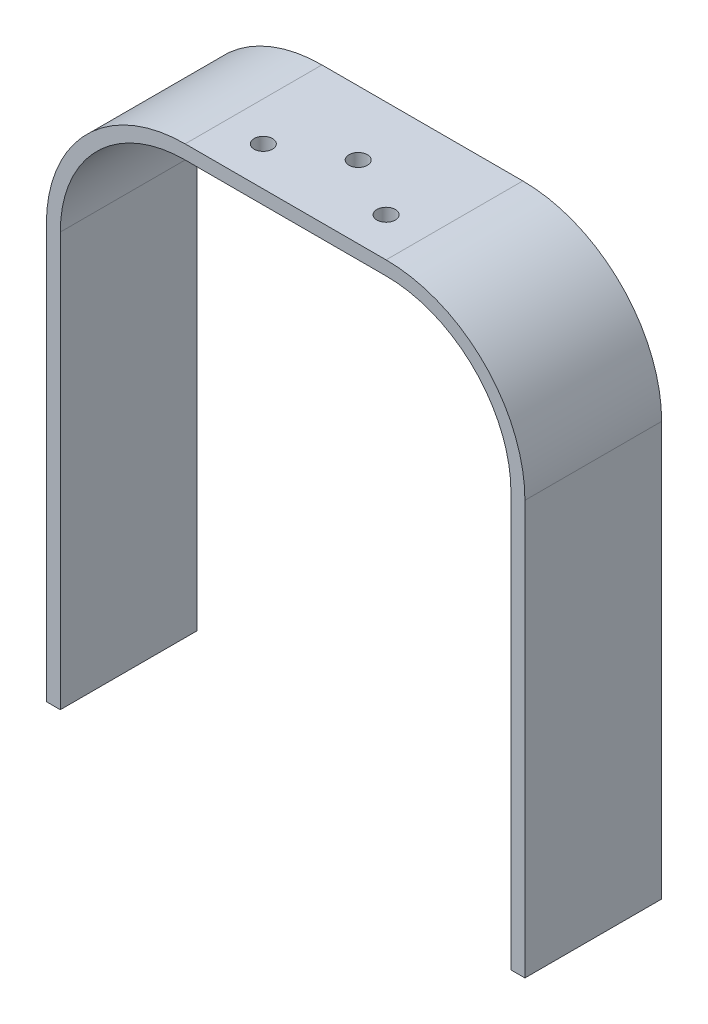
ISO-10303-21;
HEADER;
FILE_DESCRIPTION(('STEP AP214'),'2;1');
FILE_NAME('part.step','',(''),(''),'','','');
FILE_SCHEMA(('AUTOMOTIVE_DESIGN { 1 0 10303 214 1 1 1 1 }'));
ENDSEC;
DATA;
#1=APPLICATION_CONTEXT('core data for automotive mechanical design processes');
#2=APPLICATION_PROTOCOL_DEFINITION('international standard','automotive_design',2000,#1);
#3=PRODUCT_CONTEXT('',#1,'mechanical');
#4=PRODUCT('Part','Part','',(#3));
#5=PRODUCT_RELATED_PRODUCT_CATEGORY('part','',(#4));
#6=PRODUCT_DEFINITION_FORMATION('','',#4);
#7=PRODUCT_DEFINITION_CONTEXT('part definition',#1,'design');
#8=PRODUCT_DEFINITION('design','',#6,#7);
#9=PRODUCT_DEFINITION_SHAPE('','',#8);
#10=(LENGTH_UNIT() NAMED_UNIT(*) SI_UNIT(.MILLI.,.METRE.));
#11=(NAMED_UNIT(*) PLANE_ANGLE_UNIT() SI_UNIT($,.RADIAN.));
#12=(NAMED_UNIT(*) SI_UNIT($,.STERADIAN.) SOLID_ANGLE_UNIT());
#13=UNCERTAINTY_MEASURE_WITH_UNIT(LENGTH_MEASURE(1.E-05),#10,'distance_accuracy_value','');
#14=(GEOMETRIC_REPRESENTATION_CONTEXT(3) GLOBAL_UNCERTAINTY_ASSIGNED_CONTEXT((#13)) GLOBAL_UNIT_ASSIGNED_CONTEXT((#10,
#11,#12)) REPRESENTATION_CONTEXT('',''));
#15=CARTESIAN_POINT('',(0.,0.,0.));
#16=DIRECTION('',(0.,0.,1.));
#17=DIRECTION('',(1.,0.,0.));
#18=AXIS2_PLACEMENT_3D('',#15,#16,#17);
#19=CARTESIAN_POINT('',(-55.2541428168686,-8.814890245695,-4.96942607480638));
#20=DIRECTION('',(0.,1.,0.));
#21=DIRECTION('',(0.,0.,-1.));
#22=AXIS2_PLACEMENT_3D('',#19,#20,#21);
#23=PLANE('',#22);
#24=DIRECTION('',(-1.,0.,0.));
#25=VECTOR('',#24,1.);
#26=CARTESIAN_POINT('',(-55.2541428168686,-8.814890245695,-17.2194260748064));
#27=LINE('',#26,#25);
#28=CARTESIAN_POINT('',(-54.0041428168686,-8.814890245695,-17.2194260748064));
#29=VERTEX_POINT('',#28);
#30=CARTESIAN_POINT('',(-56.5041428168686,-8.814890245695,-17.2194260748064));
#31=VERTEX_POINT('',#30);
#32=EDGE_CURVE('E11',#29,#31,#27,.T.);
#33=ORIENTED_EDGE('',*,*,#32,.F.);
#34=DIRECTION('',(0.,0.,1.));
#35=VECTOR('',#34,1.);
#36=CARTESIAN_POINT('',(-54.0041428168686,-8.814890245695,-4.96942607480638));
#37=LINE('',#36,#35);
#38=CARTESIAN_POINT('',(-54.0041428168686,-8.814890245695,7.28057392519362));
#39=VERTEX_POINT('',#38);
#40=EDGE_CURVE('E174',#39,#29,#37,.F.);
#41=ORIENTED_EDGE('',*,*,#40,.F.);
#42=DIRECTION('',(-1.,0.,0.));
#43=VECTOR('',#42,1.);
#44=CARTESIAN_POINT('',(-55.2541428168686,-8.814890245695,7.28057392519362));
#45=LINE('',#44,#43);
#46=CARTESIAN_POINT('',(-56.5041428168686,-8.814890245695,7.28057392519362));
#47=VERTEX_POINT('',#46);
#48=EDGE_CURVE('E61',#39,#47,#45,.T.);
#49=ORIENTED_EDGE('',*,*,#48,.T.);
#50=DIRECTION('',(0.,0.,1.));
#51=VECTOR('',#50,1.);
#52=CARTESIAN_POINT('',(-56.5041428168686,-8.814890245695,-4.96942607480638));
#53=LINE('',#52,#51);
#54=EDGE_CURVE('E201',#47,#31,#53,.F.);
#55=ORIENTED_EDGE('',*,*,#54,.T.);
#56=EDGE_LOOP('',(#33,#41,#49,#55));
#57=FACE_BOUND('',#56,.T.);
#58=ADVANCED_FACE('F51',(#57),#23,.F.);
#59=CARTESIAN_POINT('',(27.9958571831288,-8.81489024569501,7.2805739251936));
#60=DIRECTION('',(0.,0.,1.));
#61=DIRECTION('',(0.,-1.,0.));
#62=AXIS2_PLACEMENT_3D('',#59,#60,#61);
#63=PLANE('',#62);
#64=DIRECTION('',(0.,1.,0.));
#65=VECTOR('',#64,1.);
#66=CARTESIAN_POINT('',(29.2458571831288,-8.81489024569501,7.2805739251936));
#67=LINE('',#66,#65);
#68=CARTESIAN_POINT('',(29.2458571831288,65.3101097543063,7.2805739251936));
#69=VERTEX_POINT('',#68);
#70=CARTESIAN_POINT('',(29.2458571831288,-8.81489024569501,7.2805739251936));
#71=VERTEX_POINT('',#70);
#72=EDGE_CURVE('E230',#69,#71,#67,.F.);
#73=ORIENTED_EDGE('',*,*,#72,.F.);
#74=CARTESIAN_POINT('',(4.37085718313007,65.3101097543063,7.2805739251936));
#75=DIRECTION('',(0.,0.,-1.));
#76=DIRECTION('',(-1.,0.,0.));
#77=AXIS2_PLACEMENT_3D('',#74,#75,#76);
#78=CIRCLE('',#77,24.8749999999987);
#79=CARTESIAN_POINT('',(4.37085718313007,90.185109754305,7.28057392519361));
#80=VERTEX_POINT('',#79);
#81=EDGE_CURVE('E274',#80,#69,#78,.T.);
#82=ORIENTED_EDGE('',*,*,#81,.F.);
#83=DIRECTION('',(1.,0.,0.));
#84=VECTOR('',#83,1.);
#85=CARTESIAN_POINT('',(-31.6291428168699,90.185109754305,7.28057392519361));
#86=LINE('',#85,#84);
#87=CARTESIAN_POINT('',(-31.6291428168699,90.185109754305,7.28057392519361));
#88=VERTEX_POINT('',#87);
#89=EDGE_CURVE('E224',#88,#80,#86,.T.);
#90=ORIENTED_EDGE('',*,*,#89,.F.);
#91=CARTESIAN_POINT('',(-31.6291428168699,65.3101097543063,7.28057392519361));
#92=DIRECTION('',(0.,0.,-1.));
#93=DIRECTION('',(-1.,0.,0.));
#94=AXIS2_PLACEMENT_3D('',#91,#92,#93);
#95=CIRCLE('',#94,24.8749999999987);
#96=CARTESIAN_POINT('',(-56.5041428168686,65.3101097543063,7.28057392519362));
#97=VERTEX_POINT('',#96);
#98=EDGE_CURVE('E219',#97,#88,#95,.T.);
#99=ORIENTED_EDGE('',*,*,#98,.F.);
#100=DIRECTION('',(0.,1.,0.));
#101=VECTOR('',#100,1.);
#102=CARTESIAN_POINT('',(-56.5041428168686,-8.814890245695,7.28057392519362));
#103=LINE('',#102,#101);
#104=EDGE_CURVE('E149',#47,#97,#103,.T.);
#105=ORIENTED_EDGE('',*,*,#104,.F.);
#106=ORIENTED_EDGE('',*,*,#48,.F.);
#107=DIRECTION('',(0.,1.,0.));
#108=VECTOR('',#107,1.);
#109=CARTESIAN_POINT('',(-54.0041428168686,-8.814890245695,7.28057392519362));
#110=LINE('',#109,#108);
#111=CARTESIAN_POINT('',(-54.0041428168686,65.3101097543063,7.28057392519362));
#112=VERTEX_POINT('',#111);
#113=EDGE_CURVE('E169',#39,#112,#110,.T.);
#114=ORIENTED_EDGE('',*,*,#113,.T.);
#115=CARTESIAN_POINT('',(-31.6291428168699,65.3101097543063,7.28057392519361));
#116=DIRECTION('',(0.,0.,-1.));
#117=DIRECTION('',(-1.,0.,0.));
#118=AXIS2_PLACEMENT_3D('',#115,#116,#117);
#119=CIRCLE('',#118,22.3749999999987);
#120=CARTESIAN_POINT('',(-31.6291428168699,87.685109754305,7.28057392519361));
#121=VERTEX_POINT('',#120);
#122=EDGE_CURVE('E165',#112,#121,#119,.T.);
#123=ORIENTED_EDGE('',*,*,#122,.T.);
#124=DIRECTION('',(1.,0.,0.));
#125=VECTOR('',#124,1.);
#126=CARTESIAN_POINT('',(-31.6291428168699,87.685109754305,7.28057392519361));
#127=LINE('',#126,#125);
#128=CARTESIAN_POINT('',(4.37085718313007,87.685109754305,7.28057392519361));
#129=VERTEX_POINT('',#128);
#130=EDGE_CURVE('E161',#121,#129,#127,.T.);
#131=ORIENTED_EDGE('',*,*,#130,.T.);
#132=CARTESIAN_POINT('',(4.37085718313007,65.3101097543063,7.2805739251936));
#133=DIRECTION('',(0.,0.,-1.));
#134=DIRECTION('',(-1.,0.,0.));
#135=AXIS2_PLACEMENT_3D('',#132,#133,#134);
#136=CIRCLE('',#135,22.3749999999987);
#137=CARTESIAN_POINT('',(26.7458571831288,65.3101097543063,7.2805739251936));
#138=VERTEX_POINT('',#137);
#139=EDGE_CURVE('E158',#129,#138,#136,.T.);
#140=ORIENTED_EDGE('',*,*,#139,.T.);
#141=DIRECTION('',(0.,1.,0.));
#142=VECTOR('',#141,1.);
#143=CARTESIAN_POINT('',(26.7458571831288,-8.81489024569501,7.2805739251936));
#144=LINE('',#143,#142);
#145=CARTESIAN_POINT('',(26.7458571831288,-8.81489024569501,7.2805739251936));
#146=VERTEX_POINT('',#145);
#147=EDGE_CURVE('E132',#138,#146,#144,.F.);
#148=ORIENTED_EDGE('',*,*,#147,.T.);
#149=DIRECTION('',(1.,0.,0.));
#150=VECTOR('',#149,1.);
#151=CARTESIAN_POINT('',(27.9958571831288,-8.81489024569501,7.2805739251936));
#152=LINE('',#151,#150);
#153=EDGE_CURVE('E191',#146,#71,#152,.T.);
#154=ORIENTED_EDGE('',*,*,#153,.T.);
#155=EDGE_LOOP('',(#73,#82,#90,#99,#105,#106,#114,#123,#131,#140,#148,#154));
#156=FACE_BOUND('',#155,.T.);
#157=ADVANCED_FACE('F216',(#156),#63,.T.);
#158=CARTESIAN_POINT('',(27.9958571831288,-8.81489024569501,-4.9694260748064));
#159=DIRECTION('',(0.,-1.,0.));
#160=DIRECTION('',(0.,0.,-1.));
#161=AXIS2_PLACEMENT_3D('',#158,#159,#160);
#162=PLANE('',#161);
#163=ORIENTED_EDGE('',*,*,#153,.F.);
#164=DIRECTION('',(0.,0.,1.));
#165=VECTOR('',#164,1.);
#166=CARTESIAN_POINT('',(26.7458571831288,-8.81489024569501,-4.9694260748064));
#167=LINE('',#166,#165);
#168=CARTESIAN_POINT('',(26.7458571831287,-8.81489024569501,-17.2194260748064));
#169=VERTEX_POINT('',#168);
#170=EDGE_CURVE('E146',#146,#169,#167,.F.);
#171=ORIENTED_EDGE('',*,*,#170,.T.);
#172=DIRECTION('',(1.,0.,0.));
#173=VECTOR('',#172,1.);
#174=CARTESIAN_POINT('',(27.9958571831288,-8.81489024569501,-17.2194260748064));
#175=LINE('',#174,#173);
#176=CARTESIAN_POINT('',(29.2458571831288,-8.81489024569501,-17.2194260748064));
#177=VERTEX_POINT('',#176);
#178=EDGE_CURVE('E144',#169,#177,#175,.T.);
#179=ORIENTED_EDGE('',*,*,#178,.T.);
#180=DIRECTION('',(0.,0.,1.));
#181=VECTOR('',#180,1.);
#182=CARTESIAN_POINT('',(29.2458571831288,-8.81489024569501,-4.9694260748064));
#183=LINE('',#182,#181);
#184=EDGE_CURVE('E192',#71,#177,#183,.F.);
#185=ORIENTED_EDGE('',*,*,#184,.F.);
#186=EDGE_LOOP('',(#163,#171,#179,#185));
#187=FACE_BOUND('',#186,.T.);
#188=ADVANCED_FACE('F259',(#187),#162,.T.);
#189=CARTESIAN_POINT('',(4.37085718313007,65.3101097543063,-17.2194260748064));
#190=DIRECTION('',(0.,0.,1.));
#191=DIRECTION('',(1.,0.,0.));
#192=AXIS2_PLACEMENT_3D('',#189,#190,#191);
#193=PLANE('',#192);
#194=CARTESIAN_POINT('',(4.37085718313007,65.3101097543063,-17.2194260748064));
#195=DIRECTION('',(0.,0.,-1.));
#196=DIRECTION('',(-1.,0.,0.));
#197=AXIS2_PLACEMENT_3D('',#194,#195,#196);
#198=CIRCLE('',#197,22.3749999999987);
#199=CARTESIAN_POINT('',(4.37085718313007,87.685109754305,-17.2194260748064));
#200=VERTEX_POINT('',#199);
#201=CARTESIAN_POINT('',(26.7458571831288,65.3101097543063,-17.2194260748064));
#202=VERTEX_POINT('',#201);
#203=EDGE_CURVE('E135',#200,#202,#198,.T.);
#204=ORIENTED_EDGE('',*,*,#203,.F.);
#205=DIRECTION('',(1.,0.,0.));
#206=VECTOR('',#205,1.);
#207=CARTESIAN_POINT('',(-31.6291428168699,87.685109754305,-17.2194260748064));
#208=LINE('',#207,#206);
#209=CARTESIAN_POINT('',(-31.6291428168699,87.685109754305,-17.2194260748064));
#210=VERTEX_POINT('',#209);
#211=EDGE_CURVE('E186',#210,#200,#208,.T.);
#212=ORIENTED_EDGE('',*,*,#211,.F.);
#213=CARTESIAN_POINT('',(-31.6291428168699,65.3101097543063,-17.2194260748064));
#214=DIRECTION('',(0.,0.,-1.));
#215=DIRECTION('',(-1.,0.,0.));
#216=AXIS2_PLACEMENT_3D('',#213,#214,#215);
#217=CIRCLE('',#216,22.3749999999987);
#218=CARTESIAN_POINT('',(-54.0041428168686,65.3101097543063,-17.2194260748064));
#219=VERTEX_POINT('',#218);
#220=EDGE_CURVE('E181',#219,#210,#217,.T.);
#221=ORIENTED_EDGE('',*,*,#220,.F.);
#222=DIRECTION('',(0.,1.,0.));
#223=VECTOR('',#222,1.);
#224=CARTESIAN_POINT('',(-54.0041428168686,-8.814890245695,-17.2194260748064));
#225=LINE('',#224,#223);
#226=EDGE_CURVE('E157',#29,#219,#225,.T.);
#227=ORIENTED_EDGE('',*,*,#226,.F.);
#228=ORIENTED_EDGE('',*,*,#32,.T.);
#229=DIRECTION('',(0.,1.,0.));
#230=VECTOR('',#229,1.);
#231=CARTESIAN_POINT('',(-56.5041428168686,-8.814890245695,-17.2194260748064));
#232=LINE('',#231,#230);
#233=CARTESIAN_POINT('',(-56.5041428168686,65.3101097543063,-17.2194260748064));
#234=VERTEX_POINT('',#233);
#235=EDGE_CURVE('E211',#31,#234,#232,.T.);
#236=ORIENTED_EDGE('',*,*,#235,.T.);
#237=CARTESIAN_POINT('',(-31.6291428168699,65.3101097543063,-17.2194260748064));
#238=DIRECTION('',(0.,0.,-1.));
#239=DIRECTION('',(-1.,0.,0.));
#240=AXIS2_PLACEMENT_3D('',#237,#238,#239);
#241=CIRCLE('',#240,24.8749999999987);
#242=CARTESIAN_POINT('',(-31.6291428168699,90.185109754305,-17.2194260748064));
#243=VERTEX_POINT('',#242);
#244=EDGE_CURVE('E231',#234,#243,#241,.T.);
#245=ORIENTED_EDGE('',*,*,#244,.T.);
#246=DIRECTION('',(1.,0.,0.));
#247=VECTOR('',#246,1.);
#248=CARTESIAN_POINT('',(-31.6291428168699,90.185109754305,-17.2194260748064));
#249=LINE('',#248,#247);
#250=CARTESIAN_POINT('',(4.37085718313007,90.185109754305,-17.2194260748064));
#251=VERTEX_POINT('',#250);
#252=EDGE_CURVE('E236',#243,#251,#249,.T.);
#253=ORIENTED_EDGE('',*,*,#252,.T.);
#254=CARTESIAN_POINT('',(4.37085718313007,65.3101097543063,-17.2194260748064));
#255=DIRECTION('',(0.,0.,-1.));
#256=DIRECTION('',(-1.,0.,0.));
#257=AXIS2_PLACEMENT_3D('',#254,#255,#256);
#258=CIRCLE('',#257,24.8749999999987);
#259=CARTESIAN_POINT('',(29.2458571831288,65.3101097543063,-17.2194260748064));
#260=VERTEX_POINT('',#259);
#261=EDGE_CURVE('E241',#251,#260,#258,.T.);
#262=ORIENTED_EDGE('',*,*,#261,.T.);
#263=DIRECTION('',(0.,1.,0.));
#264=VECTOR('',#263,1.);
#265=CARTESIAN_POINT('',(29.2458571831288,-8.81489024569501,-17.2194260748064));
#266=LINE('',#265,#264);
#267=EDGE_CURVE('E266',#260,#177,#266,.F.);
#268=ORIENTED_EDGE('',*,*,#267,.T.);
#269=ORIENTED_EDGE('',*,*,#178,.F.);
#270=DIRECTION('',(0.,1.,0.));
#271=VECTOR('',#270,1.);
#272=CARTESIAN_POINT('',(26.7458571831287,-8.81489024569501,-17.2194260748064));
#273=LINE('',#272,#271);
#274=EDGE_CURVE('E129',#202,#169,#273,.F.);
#275=ORIENTED_EDGE('',*,*,#274,.F.);
#276=EDGE_LOOP('',(#204,#212,#221,#227,#228,#236,#245,#253,#262,#268,#269,#275));
#277=FACE_BOUND('',#276,.T.);
#278=ADVANCED_FACE('F53',(#277),#193,.F.);
#279=CARTESIAN_POINT('',(29.2458571831288,-8.81489024569501,-4.9694260748064));
#280=DIRECTION('',(1.,0.,0.));
#281=DIRECTION('',(0.,1.,0.));
#282=AXIS2_PLACEMENT_3D('',#279,#280,#281);
#283=PLANE('',#282);
#284=ORIENTED_EDGE('',*,*,#267,.F.);
#285=DIRECTION('',(0.,0.,-1.));
#286=VECTOR('',#285,1.);
#287=CARTESIAN_POINT('',(29.2458571831288,65.3101097543063,-4.9694260748064));
#288=LINE('',#287,#286);
#289=EDGE_CURVE('E244',#69,#260,#288,.T.);
#290=ORIENTED_EDGE('',*,*,#289,.F.);
#291=ORIENTED_EDGE('',*,*,#72,.T.);
#292=ORIENTED_EDGE('',*,*,#184,.T.);
#293=EDGE_LOOP('',(#284,#290,#291,#292));
#294=FACE_BOUND('',#293,.T.);
#295=ADVANCED_FACE('F306',(#294),#283,.T.);
#296=CARTESIAN_POINT('',(4.37085718313007,65.3101097543063,-4.9694260748064));
#297=DIRECTION('',(0.,0.,-1.));
#298=DIRECTION('',(-1.,0.,0.));
#299=AXIS2_PLACEMENT_3D('',#296,#297,#298);
#300=CYLINDRICAL_SURFACE('',#299,24.8749999999987);
#301=ORIENTED_EDGE('',*,*,#261,.F.);
#302=DIRECTION('',(0.,0.,1.));
#303=VECTOR('',#302,1.);
#304=CARTESIAN_POINT('',(4.37085718313007,90.185109754305,-4.96942607480639));
#305=LINE('',#304,#303);
#306=EDGE_CURVE('E240',#80,#251,#305,.F.);
#307=ORIENTED_EDGE('',*,*,#306,.F.);
#308=ORIENTED_EDGE('',*,*,#81,.T.);
#309=ORIENTED_EDGE('',*,*,#289,.T.);
#310=EDGE_LOOP('',(#301,#307,#308,#309));
#311=FACE_BOUND('',#310,.T.);
#312=ADVANCED_FACE('F292',(#311),#300,.T.);
#313=CARTESIAN_POINT('',(-31.6291428168699,90.185109754305,-4.96942607480639));
#314=DIRECTION('',(0.,1.,0.));
#315=DIRECTION('',(0.,0.,1.));
#316=AXIS2_PLACEMENT_3D('',#313,#314,#315);
#317=PLANE('',#316);
#318=CARTESIAN_POINT('',(-24.6291428168699,90.185109754305,0.280573925193613));
#319=DIRECTION('',(0.,1.,0.));
#320=DIRECTION('',(0.,0.,1.));
#321=AXIS2_PLACEMENT_3D('',#318,#319,#320);
#322=CIRCLE('',#321,1.65);
#323=CARTESIAN_POINT('',(-24.6291428168699,90.185109754305,1.93057392519361));
#324=VERTEX_POINT('',#323);
#325=EDGE_CURVE('E346',#324,#324,#322,.T.);
#326=ORIENTED_EDGE('',*,*,#325,.F.);
#327=EDGE_LOOP('',(#326));
#328=FACE_BOUND('',#327,.T.);
#329=CARTESIAN_POINT('',(-2.62914281686993,90.185109754305,0.280573925193613));
#330=DIRECTION('',(0.,1.,0.));
#331=DIRECTION('',(0.,0.,-1.));
#332=AXIS2_PLACEMENT_3D('',#329,#330,#331);
#333=CIRCLE('',#332,1.65);
#334=CARTESIAN_POINT('',(-2.62914281686993,90.185109754305,1.93057392519361));
#335=VERTEX_POINT('',#334);
#336=EDGE_CURVE('E350',#335,#335,#333,.T.);
#337=ORIENTED_EDGE('',*,*,#336,.F.);
#338=EDGE_LOOP('',(#337));
#339=FACE_BOUND('',#338,.T.);
#340=CARTESIAN_POINT('',(-13.6291428168699,90.185109754305,-5.71942607480639));
#341=DIRECTION('',(0.,1.,0.));
#342=DIRECTION('',(0.,0.,1.));
#343=AXIS2_PLACEMENT_3D('',#340,#341,#342);
#344=CIRCLE('',#343,1.65);
#345=CARTESIAN_POINT('',(-13.6291428168699,90.185109754305,-4.06942607480639));
#346=VERTEX_POINT('',#345);
#347=EDGE_CURVE('E353',#346,#346,#344,.T.);
#348=ORIENTED_EDGE('',*,*,#347,.F.);
#349=EDGE_LOOP('',(#348));
#350=FACE_BOUND('',#349,.T.);
#351=ORIENTED_EDGE('',*,*,#252,.F.);
#352=DIRECTION('',(0.,0.,-1.));
#353=VECTOR('',#352,1.);
#354=CARTESIAN_POINT('',(-31.6291428168699,90.185109754305,-4.96942607480639));
#355=LINE('',#354,#353);
#356=EDGE_CURVE('E235',#88,#243,#355,.T.);
#357=ORIENTED_EDGE('',*,*,#356,.F.);
#358=ORIENTED_EDGE('',*,*,#89,.T.);
#359=ORIENTED_EDGE('',*,*,#306,.T.);
#360=EDGE_LOOP('',(#351,#357,#358,#359));
#361=FACE_BOUND('',#360,.T.);
#362=ADVANCED_FACE('F284',(#328,#339,#350,#361),#317,.T.);
#363=CARTESIAN_POINT('',(-31.6291428168699,65.3101097543063,-4.96942607480639));
#364=DIRECTION('',(0.,0.,-1.));
#365=DIRECTION('',(-1.,0.,0.));
#366=AXIS2_PLACEMENT_3D('',#363,#364,#365);
#367=CYLINDRICAL_SURFACE('',#366,24.8749999999987);
#368=ORIENTED_EDGE('',*,*,#244,.F.);
#369=DIRECTION('',(0.,0.,1.));
#370=VECTOR('',#369,1.);
#371=CARTESIAN_POINT('',(-56.5041428168686,65.3101097543063,-4.96942607480638));
#372=LINE('',#371,#370);
#373=EDGE_CURVE('E213',#97,#234,#372,.F.);
#374=ORIENTED_EDGE('',*,*,#373,.F.);
#375=ORIENTED_EDGE('',*,*,#98,.T.);
#376=ORIENTED_EDGE('',*,*,#356,.T.);
#377=EDGE_LOOP('',(#368,#374,#375,#376));
#378=FACE_BOUND('',#377,.T.);
#379=ADVANCED_FACE('F301',(#378),#367,.T.);
#380=CARTESIAN_POINT('',(-56.5041428168686,-8.814890245695,-4.96942607480638));
#381=DIRECTION('',(-1.,0.,0.));
#382=DIRECTION('',(0.,0.,1.));
#383=AXIS2_PLACEMENT_3D('',#380,#381,#382);
#384=PLANE('',#383);
#385=ORIENTED_EDGE('',*,*,#235,.F.);
#386=ORIENTED_EDGE('',*,*,#54,.F.);
#387=ORIENTED_EDGE('',*,*,#104,.T.);
#388=ORIENTED_EDGE('',*,*,#373,.T.);
#389=EDGE_LOOP('',(#385,#386,#387,#388));
#390=FACE_BOUND('',#389,.T.);
#391=ADVANCED_FACE('F208',(#390),#384,.T.);
#392=CARTESIAN_POINT('',(26.7458571831288,-8.81489024569501,-4.9694260748064));
#393=DIRECTION('',(1.,0.,0.));
#394=DIRECTION('',(0.,1.,0.));
#395=AXIS2_PLACEMENT_3D('',#392,#393,#394);
#396=PLANE('',#395);
#397=ORIENTED_EDGE('',*,*,#274,.T.);
#398=ORIENTED_EDGE('',*,*,#170,.F.);
#399=ORIENTED_EDGE('',*,*,#147,.F.);
#400=DIRECTION('',(0.,0.,-1.));
#401=VECTOR('',#400,1.);
#402=CARTESIAN_POINT('',(26.7458571831288,65.3101097543063,-4.9694260748064));
#403=LINE('',#402,#401);
#404=EDGE_CURVE('E125',#138,#202,#403,.T.);
#405=ORIENTED_EDGE('',*,*,#404,.T.);
#406=EDGE_LOOP('',(#397,#398,#399,#405));
#407=FACE_BOUND('',#406,.T.);
#408=ADVANCED_FACE('F126',(#407),#396,.F.);
#409=CARTESIAN_POINT('',(4.37085718313007,65.3101097543063,-4.9694260748064));
#410=DIRECTION('',(0.,0.,-1.));
#411=DIRECTION('',(-1.,0.,0.));
#412=AXIS2_PLACEMENT_3D('',#409,#410,#411);
#413=CYLINDRICAL_SURFACE('',#412,22.3749999999987);
#414=ORIENTED_EDGE('',*,*,#203,.T.);
#415=ORIENTED_EDGE('',*,*,#404,.F.);
#416=ORIENTED_EDGE('',*,*,#139,.F.);
#417=DIRECTION('',(0.,0.,1.));
#418=VECTOR('',#417,1.);
#419=CARTESIAN_POINT('',(4.37085718313007,87.685109754305,-4.96942607480639));
#420=LINE('',#419,#418);
#421=EDGE_CURVE('E119',#129,#200,#420,.F.);
#422=ORIENTED_EDGE('',*,*,#421,.T.);
#423=EDGE_LOOP('',(#414,#415,#416,#422));
#424=FACE_BOUND('',#423,.T.);
#425=ADVANCED_FACE('F138',(#424),#413,.F.);
#426=CARTESIAN_POINT('',(-31.6291428168699,87.685109754305,-4.96942607480639));
#427=DIRECTION('',(0.,1.,0.));
#428=DIRECTION('',(0.,0.,1.));
#429=AXIS2_PLACEMENT_3D('',#426,#427,#428);
#430=PLANE('',#429);
#431=CARTESIAN_POINT('',(-24.6291428168699,87.685109754305,0.280573925193613));
#432=DIRECTION('',(0.,1.,0.));
#433=DIRECTION('',(0.,0.,1.));
#434=AXIS2_PLACEMENT_3D('',#431,#432,#433);
#435=CIRCLE('',#434,1.65);
#436=CARTESIAN_POINT('',(-24.6291428168699,87.685109754305,1.93057392519361));
#437=VERTEX_POINT('',#436);
#438=EDGE_CURVE('E173',#437,#437,#435,.F.);
#439=ORIENTED_EDGE('',*,*,#438,.F.);
#440=EDGE_LOOP('',(#439));
#441=FACE_BOUND('',#440,.T.);
#442=CARTESIAN_POINT('',(-2.62914281686993,87.685109754305,0.280573925193613));
#443=DIRECTION('',(0.,1.,0.));
#444=DIRECTION('',(0.,0.,1.));
#445=AXIS2_PLACEMENT_3D('',#442,#443,#444);
#446=CIRCLE('',#445,1.65);
#447=CARTESIAN_POINT('',(-2.62914281686993,87.685109754305,1.93057392519361));
#448=VERTEX_POINT('',#447);
#449=EDGE_CURVE('E361',#448,#448,#446,.F.);
#450=ORIENTED_EDGE('',*,*,#449,.F.);
#451=EDGE_LOOP('',(#450));
#452=FACE_BOUND('',#451,.T.);
#453=CARTESIAN_POINT('',(-13.6291428168699,87.685109754305,-5.71942607480639));
#454=DIRECTION('',(0.,1.,0.));
#455=DIRECTION('',(0.,0.,1.));
#456=AXIS2_PLACEMENT_3D('',#453,#454,#455);
#457=CIRCLE('',#456,1.65);
#458=CARTESIAN_POINT('',(-13.6291428168699,87.685109754305,-4.06942607480639));
#459=VERTEX_POINT('',#458);
#460=EDGE_CURVE('E356',#459,#459,#457,.F.);
#461=ORIENTED_EDGE('',*,*,#460,.F.);
#462=EDGE_LOOP('',(#461));
#463=FACE_BOUND('',#462,.T.);
#464=ORIENTED_EDGE('',*,*,#211,.T.);
#465=ORIENTED_EDGE('',*,*,#421,.F.);
#466=ORIENTED_EDGE('',*,*,#130,.F.);
#467=DIRECTION('',(0.,0.,-1.));
#468=VECTOR('',#467,1.);
#469=CARTESIAN_POINT('',(-31.6291428168699,87.685109754305,-4.96942607480639));
#470=LINE('',#469,#468);
#471=EDGE_CURVE('E185',#121,#210,#470,.T.);
#472=ORIENTED_EDGE('',*,*,#471,.T.);
#473=EDGE_LOOP('',(#464,#465,#466,#472));
#474=FACE_BOUND('',#473,.T.);
#475=ADVANCED_FACE('F250',(#441,#452,#463,#474),#430,.F.);
#476=CARTESIAN_POINT('',(-31.6291428168699,65.3101097543063,-4.96942607480639));
#477=DIRECTION('',(0.,0.,-1.));
#478=DIRECTION('',(-1.,0.,0.));
#479=AXIS2_PLACEMENT_3D('',#476,#477,#478);
#480=CYLINDRICAL_SURFACE('',#479,22.3749999999987);
#481=ORIENTED_EDGE('',*,*,#220,.T.);
#482=ORIENTED_EDGE('',*,*,#471,.F.);
#483=ORIENTED_EDGE('',*,*,#122,.F.);
#484=DIRECTION('',(0.,0.,1.));
#485=VECTOR('',#484,1.);
#486=CARTESIAN_POINT('',(-54.0041428168686,65.3101097543063,-4.96942607480638));
#487=LINE('',#486,#485);
#488=EDGE_CURVE('E152',#112,#219,#487,.F.);
#489=ORIENTED_EDGE('',*,*,#488,.T.);
#490=EDGE_LOOP('',(#481,#482,#483,#489));
#491=FACE_BOUND('',#490,.T.);
#492=ADVANCED_FACE('F254',(#491),#480,.F.);
#493=CARTESIAN_POINT('',(-54.0041428168686,-8.814890245695,-4.96942607480638));
#494=DIRECTION('',(-1.,0.,0.));
#495=DIRECTION('',(0.,0.,1.));
#496=AXIS2_PLACEMENT_3D('',#493,#494,#495);
#497=PLANE('',#496);
#498=ORIENTED_EDGE('',*,*,#226,.T.);
#499=ORIENTED_EDGE('',*,*,#488,.F.);
#500=ORIENTED_EDGE('',*,*,#113,.F.);
#501=ORIENTED_EDGE('',*,*,#40,.T.);
#502=EDGE_LOOP('',(#498,#499,#500,#501));
#503=FACE_BOUND('',#502,.T.);
#504=ADVANCED_FACE('F256',(#503),#497,.F.);
#505=CARTESIAN_POINT('',(-13.6291428168699,83.0182049984738,-5.71942607480639));
#506=DIRECTION('',(0.,1.,0.));
#507=DIRECTION('',(0.,0.,1.));
#508=AXIS2_PLACEMENT_3D('',#505,#506,#507);
#509=CYLINDRICAL_SURFACE('',#508,1.65);
#510=CARTESIAN_POINT('',(-13.6291428168699,87.685109754305,-4.06942607480639));
#511=CARTESIAN_POINT('',(-13.6291428168699,87.7111514209716,-4.06942607480639));
#512=CARTESIAN_POINT('',(-13.6291428168699,87.7371930876383,-4.06942607480639));
#513=CARTESIAN_POINT('',(-13.6291428168699,87.7892764209717,-4.06942607480639));
#514=CARTESIAN_POINT('',(-13.6291428168699,87.8153180876383,-4.06942607480639));
#515=CARTESIAN_POINT('',(-13.6291428168699,87.8674014209717,-4.06942607480639));
#516=CARTESIAN_POINT('',(-13.6291428168699,87.8934430876383,-4.06942607480639));
#517=CARTESIAN_POINT('',(-13.6291428168699,87.9455264209717,-4.06942607480639));
#518=CARTESIAN_POINT('',(-13.6291428168699,87.9715680876383,-4.06942607480639));
#519=CARTESIAN_POINT('',(-13.6291428168699,88.0236514209717,-4.06942607480639));
#520=CARTESIAN_POINT('',(-13.6291428168699,88.0496930876383,-4.06942607480639));
#521=CARTESIAN_POINT('',(-13.6291428168699,88.1017764209716,-4.06942607480639));
#522=CARTESIAN_POINT('',(-13.6291428168699,88.1278180876383,-4.06942607480639));
#523=CARTESIAN_POINT('',(-13.6291428168699,88.1799014209716,-4.06942607480639));
#524=CARTESIAN_POINT('',(-13.6291428168699,88.2059430876383,-4.06942607480639));
#525=CARTESIAN_POINT('',(-13.6291428168699,88.2580264209716,-4.06942607480639));
#526=CARTESIAN_POINT('',(-13.6291428168699,88.2840680876383,-4.06942607480639));
#527=CARTESIAN_POINT('',(-13.6291428168699,88.3361514209716,-4.06942607480639));
#528=CARTESIAN_POINT('',(-13.6291428168699,88.3621930876383,-4.06942607480639));
#529=CARTESIAN_POINT('',(-13.6291428168699,88.4142764209717,-4.06942607480639));
#530=CARTESIAN_POINT('',(-13.6291428168699,88.4403180876383,-4.06942607480639));
#531=CARTESIAN_POINT('',(-13.6291428168699,88.4924014209717,-4.06942607480639));
#532=CARTESIAN_POINT('',(-13.6291428168699,88.5184430876383,-4.06942607480639));
#533=CARTESIAN_POINT('',(-13.6291428168699,88.5705264209717,-4.06942607480639));
#534=CARTESIAN_POINT('',(-13.6291428168699,88.5965680876383,-4.06942607480639));
#535=CARTESIAN_POINT('',(-13.6291428168699,88.6486514209717,-4.06942607480639));
#536=CARTESIAN_POINT('',(-13.6291428168699,88.6746930876383,-4.06942607480639));
#537=CARTESIAN_POINT('',(-13.6291428168699,88.7267764209717,-4.06942607480639));
#538=CARTESIAN_POINT('',(-13.6291428168699,88.7528180876383,-4.06942607480639));
#539=CARTESIAN_POINT('',(-13.6291428168699,88.8049014209716,-4.06942607480639));
#540=CARTESIAN_POINT('',(-13.6291428168699,88.8309430876383,-4.06942607480639));
#541=CARTESIAN_POINT('',(-13.6291428168699,88.8830264209716,-4.06942607480639));
#542=CARTESIAN_POINT('',(-13.6291428168699,88.9090680876383,-4.06942607480639));
#543=CARTESIAN_POINT('',(-13.6291428168699,88.9611514209716,-4.06942607480639));
#544=CARTESIAN_POINT('',(-13.6291428168699,88.9871930876383,-4.06942607480639));
#545=CARTESIAN_POINT('',(-13.6291428168699,89.0392764209717,-4.06942607480639));
#546=CARTESIAN_POINT('',(-13.6291428168699,89.0653180876383,-4.06942607480639));
#547=CARTESIAN_POINT('',(-13.6291428168699,89.1174014209717,-4.06942607480639));
#548=CARTESIAN_POINT('',(-13.6291428168699,89.1434430876383,-4.06942607480639));
#549=CARTESIAN_POINT('',(-13.6291428168699,89.1955264209717,-4.06942607480639));
#550=CARTESIAN_POINT('',(-13.6291428168699,89.2215680876383,-4.06942607480639));
#551=CARTESIAN_POINT('',(-13.6291428168699,89.2736514209717,-4.06942607480639));
#552=CARTESIAN_POINT('',(-13.6291428168699,89.2996930876383,-4.06942607480639));
#553=CARTESIAN_POINT('',(-13.6291428168699,89.3517764209717,-4.06942607480639));
#554=CARTESIAN_POINT('',(-13.6291428168699,89.3778180876383,-4.06942607480639));
#555=CARTESIAN_POINT('',(-13.6291428168699,89.4299014209716,-4.06942607480639));
#556=CARTESIAN_POINT('',(-13.6291428168699,89.4559430876383,-4.06942607480639));
#557=CARTESIAN_POINT('',(-13.6291428168699,89.5080264209716,-4.06942607480639));
#558=CARTESIAN_POINT('',(-13.6291428168699,89.5340680876383,-4.06942607480639));
#559=CARTESIAN_POINT('',(-13.6291428168699,89.5861514209716,-4.06942607480639));
#560=CARTESIAN_POINT('',(-13.6291428168699,89.6121930876383,-4.06942607480639));
#561=CARTESIAN_POINT('',(-13.6291428168699,89.6642764209717,-4.06942607480639));
#562=CARTESIAN_POINT('',(-13.6291428168699,89.6903180876383,-4.06942607480639));
#563=CARTESIAN_POINT('',(-13.6291428168699,89.7424014209717,-4.06942607480639));
#564=CARTESIAN_POINT('',(-13.6291428168699,89.7684430876383,-4.06942607480639));
#565=CARTESIAN_POINT('',(-13.6291428168699,89.8205264209717,-4.06942607480639));
#566=CARTESIAN_POINT('',(-13.6291428168699,89.8465680876383,-4.06942607480639));
#567=CARTESIAN_POINT('',(-13.6291428168699,89.8986514209717,-4.06942607480639));
#568=CARTESIAN_POINT('',(-13.6291428168699,89.9246930876383,-4.06942607480639));
#569=CARTESIAN_POINT('',(-13.6291428168699,89.9767764209717,-4.06942607480639));
#570=CARTESIAN_POINT('',(-13.6291428168699,90.0028180876383,-4.06942607480639));
#571=CARTESIAN_POINT('',(-13.6291428168699,90.0549014209716,-4.06942607480639));
#572=CARTESIAN_POINT('',(-13.6291428168699,90.0809430876383,-4.06942607480639));
#573=CARTESIAN_POINT('',(-13.6291428168699,90.1330264209716,-4.06942607480639));
#574=CARTESIAN_POINT('',(-13.6291428168699,90.1590680876383,-4.06942607480639));
#575=CARTESIAN_POINT('',(-13.6291428168699,90.185109754305,-4.06942607480639));
#576=B_SPLINE_CURVE_WITH_KNOTS('',3,(#510,#511,#512,#513,#514,#515,#516,#517,#518,#519,#520,
#521,#522,#523,#524,#525,#526,#527,#528,#529,#530,#531,#532,#533,#534,#535,#536,#537,#538,#539,
#540,#541,#542,#543,#544,#545,#546,#547,#548,#549,#550,#551,#552,#553,#554,#555,#556,#557,#558,
#559,#560,#561,#562,#563,#564,#565,#566,#567,#568,#569,#570,#571,#572,#573,#574,#575),
.UNSPECIFIED.,.F.,.F.,(4,2,2,2,2,2,2,2,2,2,2,2,2,2,2,2,2,2,2,2,2,2,2,2,2,2,2,2,2,2,2,2,4),(0.,
0.0781250000000122,0.156250000000011,0.234375000000009,0.312500000000007,0.390625000000006,
0.468750000000004,0.546875000000002,0.625000000000001,0.703125000000013,0.781250000000011,
0.859375000000009,0.937500000000008,1.01562500000001,1.09375,1.171875,1.25,1.32812500000001,
1.40625000000001,1.48437500000001,1.56250000000001,1.64062500000001,1.71875,1.796875,1.875,
1.95312500000001,2.03125000000001,2.10937500000001,2.18750000000001,2.26562500000001,
2.34375000000001,2.421875,2.5),.UNSPECIFIED.);
#577=EDGE_CURVE('BSEAM325',#459,#346,#576,.T.);
#578=ORIENTED_EDGE('',*,*,#460,.T.);
#579=ORIENTED_EDGE('',*,*,#347,.T.);
#580=ORIENTED_EDGE('',*,*,#577,.T.);
#581=ORIENTED_EDGE('',*,*,#577,.F.);
#582=EDGE_LOOP('',(#578,#580,#579,#581));
#583=FACE_BOUND('',#582,.T.);
#584=ADVANCED_FACE('F325',(#583),#509,.F.);
#585=CARTESIAN_POINT('',(-2.62914281686993,83.0182049984738,0.280573925193613));
#586=DIRECTION('',(0.,1.,0.));
#587=DIRECTION('',(0.,0.,1.));
#588=AXIS2_PLACEMENT_3D('',#585,#586,#587);
#589=CYLINDRICAL_SURFACE('',#588,1.65);
#590=CARTESIAN_POINT('',(-2.62914281686993,87.685109754305,1.93057392519361));
#591=CARTESIAN_POINT('',(-2.62914281686993,87.7111514209716,1.93057392519361));
#592=CARTESIAN_POINT('',(-2.62914281686993,87.7371930876383,1.93057392519361));
#593=CARTESIAN_POINT('',(-2.62914281686993,87.7892764209717,1.93057392519361));
#594=CARTESIAN_POINT('',(-2.62914281686993,87.8153180876383,1.93057392519361));
#595=CARTESIAN_POINT('',(-2.62914281686993,87.8674014209717,1.93057392519361));
#596=CARTESIAN_POINT('',(-2.62914281686993,87.8934430876383,1.93057392519361));
#597=CARTESIAN_POINT('',(-2.62914281686993,87.9455264209717,1.93057392519361));
#598=CARTESIAN_POINT('',(-2.62914281686993,87.9715680876383,1.93057392519361));
#599=CARTESIAN_POINT('',(-2.62914281686993,88.0236514209717,1.93057392519361));
#600=CARTESIAN_POINT('',(-2.62914281686993,88.0496930876383,1.93057392519361));
#601=CARTESIAN_POINT('',(-2.62914281686993,88.1017764209716,1.93057392519361));
#602=CARTESIAN_POINT('',(-2.62914281686993,88.1278180876383,1.93057392519361));
#603=CARTESIAN_POINT('',(-2.62914281686993,88.1799014209716,1.93057392519361));
#604=CARTESIAN_POINT('',(-2.62914281686993,88.2059430876383,1.93057392519361));
#605=CARTESIAN_POINT('',(-2.62914281686993,88.2580264209716,1.93057392519361));
#606=CARTESIAN_POINT('',(-2.62914281686993,88.2840680876383,1.93057392519361));
#607=CARTESIAN_POINT('',(-2.62914281686993,88.3361514209716,1.93057392519361));
#608=CARTESIAN_POINT('',(-2.62914281686993,88.3621930876383,1.93057392519361));
#609=CARTESIAN_POINT('',(-2.62914281686993,88.4142764209717,1.93057392519361));
#610=CARTESIAN_POINT('',(-2.62914281686993,88.4403180876383,1.93057392519361));
#611=CARTESIAN_POINT('',(-2.62914281686993,88.4924014209717,1.93057392519361));
#612=CARTESIAN_POINT('',(-2.62914281686993,88.5184430876383,1.93057392519361));
#613=CARTESIAN_POINT('',(-2.62914281686993,88.5705264209717,1.93057392519361));
#614=CARTESIAN_POINT('',(-2.62914281686993,88.5965680876383,1.93057392519361));
#615=CARTESIAN_POINT('',(-2.62914281686993,88.6486514209717,1.93057392519361));
#616=CARTESIAN_POINT('',(-2.62914281686993,88.6746930876383,1.93057392519361));
#617=CARTESIAN_POINT('',(-2.62914281686993,88.7267764209717,1.93057392519361));
#618=CARTESIAN_POINT('',(-2.62914281686993,88.7528180876383,1.93057392519361));
#619=CARTESIAN_POINT('',(-2.62914281686993,88.8049014209716,1.93057392519361));
#620=CARTESIAN_POINT('',(-2.62914281686993,88.8309430876383,1.93057392519361));
#621=CARTESIAN_POINT('',(-2.62914281686993,88.8830264209716,1.93057392519361));
#622=CARTESIAN_POINT('',(-2.62914281686993,88.9090680876383,1.93057392519361));
#623=CARTESIAN_POINT('',(-2.62914281686993,88.9611514209716,1.93057392519361));
#624=CARTESIAN_POINT('',(-2.62914281686993,88.9871930876383,1.93057392519361));
#625=CARTESIAN_POINT('',(-2.62914281686993,89.0392764209717,1.93057392519361));
#626=CARTESIAN_POINT('',(-2.62914281686993,89.0653180876383,1.93057392519361));
#627=CARTESIAN_POINT('',(-2.62914281686993,89.1174014209717,1.93057392519361));
#628=CARTESIAN_POINT('',(-2.62914281686993,89.1434430876383,1.93057392519361));
#629=CARTESIAN_POINT('',(-2.62914281686993,89.1955264209717,1.93057392519361));
#630=CARTESIAN_POINT('',(-2.62914281686993,89.2215680876383,1.93057392519361));
#631=CARTESIAN_POINT('',(-2.62914281686993,89.2736514209717,1.93057392519361));
#632=CARTESIAN_POINT('',(-2.62914281686993,89.2996930876383,1.93057392519361));
#633=CARTESIAN_POINT('',(-2.62914281686993,89.3517764209717,1.93057392519361));
#634=CARTESIAN_POINT('',(-2.62914281686993,89.3778180876383,1.93057392519361));
#635=CARTESIAN_POINT('',(-2.62914281686993,89.4299014209716,1.93057392519361));
#636=CARTESIAN_POINT('',(-2.62914281686993,89.4559430876383,1.93057392519361));
#637=CARTESIAN_POINT('',(-2.62914281686993,89.5080264209716,1.93057392519361));
#638=CARTESIAN_POINT('',(-2.62914281686993,89.5340680876383,1.93057392519361));
#639=CARTESIAN_POINT('',(-2.62914281686993,89.5861514209716,1.93057392519361));
#640=CARTESIAN_POINT('',(-2.62914281686993,89.6121930876383,1.93057392519361));
#641=CARTESIAN_POINT('',(-2.62914281686993,89.6642764209717,1.93057392519361));
#642=CARTESIAN_POINT('',(-2.62914281686993,89.6903180876383,1.93057392519361));
#643=CARTESIAN_POINT('',(-2.62914281686993,89.7424014209717,1.93057392519361));
#644=CARTESIAN_POINT('',(-2.62914281686993,89.7684430876383,1.93057392519361));
#645=CARTESIAN_POINT('',(-2.62914281686993,89.8205264209717,1.93057392519361));
#646=CARTESIAN_POINT('',(-2.62914281686993,89.8465680876383,1.93057392519361));
#647=CARTESIAN_POINT('',(-2.62914281686993,89.8986514209717,1.93057392519361));
#648=CARTESIAN_POINT('',(-2.62914281686993,89.9246930876383,1.93057392519361));
#649=CARTESIAN_POINT('',(-2.62914281686993,89.9767764209717,1.93057392519361));
#650=CARTESIAN_POINT('',(-2.62914281686993,90.0028180876383,1.93057392519361));
#651=CARTESIAN_POINT('',(-2.62914281686993,90.0549014209716,1.93057392519361));
#652=CARTESIAN_POINT('',(-2.62914281686993,90.0809430876383,1.93057392519361));
#653=CARTESIAN_POINT('',(-2.62914281686993,90.1330264209716,1.93057392519361));
#654=CARTESIAN_POINT('',(-2.62914281686993,90.1590680876383,1.93057392519361));
#655=CARTESIAN_POINT('',(-2.62914281686993,90.185109754305,1.93057392519361));
#656=B_SPLINE_CURVE_WITH_KNOTS('',3,(#590,#591,#592,#593,#594,#595,#596,#597,#598,#599,#600,
#601,#602,#603,#604,#605,#606,#607,#608,#609,#610,#611,#612,#613,#614,#615,#616,#617,#618,#619,
#620,#621,#622,#623,#624,#625,#626,#627,#628,#629,#630,#631,#632,#633,#634,#635,#636,#637,#638,
#639,#640,#641,#642,#643,#644,#645,#646,#647,#648,#649,#650,#651,#652,#653,#654,#655),
.UNSPECIFIED.,.F.,.F.,(4,2,2,2,2,2,2,2,2,2,2,2,2,2,2,2,2,2,2,2,2,2,2,2,2,2,2,2,2,2,2,2,4),(0.,
0.0781250000000122,0.156250000000011,0.234375000000009,0.312500000000007,0.390625000000006,
0.468750000000004,0.546875000000002,0.625000000000001,0.703125000000013,0.781250000000011,
0.859375000000009,0.937500000000008,1.01562500000001,1.09375,1.171875,1.25,1.32812500000001,
1.40625000000001,1.48437500000001,1.56250000000001,1.64062500000001,1.71875,1.796875,1.875,
1.95312500000001,2.03125000000001,2.10937500000001,2.18750000000001,2.26562500000001,
2.34375000000001,2.421875,2.5),.UNSPECIFIED.);
#657=EDGE_CURVE('BSEAM374',#448,#335,#656,.T.);
#658=ORIENTED_EDGE('',*,*,#449,.T.);
#659=ORIENTED_EDGE('',*,*,#336,.T.);
#660=ORIENTED_EDGE('',*,*,#657,.T.);
#661=ORIENTED_EDGE('',*,*,#657,.F.);
#662=EDGE_LOOP('',(#658,#660,#659,#661));
#663=FACE_BOUND('',#662,.T.);
#664=ADVANCED_FACE('F374',(#663),#589,.F.);
#665=CARTESIAN_POINT('',(-24.6291428168699,83.0182049984738,0.280573925193613));
#666=DIRECTION('',(0.,1.,0.));
#667=DIRECTION('',(0.,0.,1.));
#668=AXIS2_PLACEMENT_3D('',#665,#666,#667);
#669=CYLINDRICAL_SURFACE('',#668,1.65);
#670=CARTESIAN_POINT('',(-24.6291428168699,87.685109754305,1.93057392519361));
#671=CARTESIAN_POINT('',(-24.6291428168699,87.7111514209716,1.93057392519361));
#672=CARTESIAN_POINT('',(-24.6291428168699,87.7371930876383,1.93057392519361));
#673=CARTESIAN_POINT('',(-24.6291428168699,87.7892764209717,1.93057392519361));
#674=CARTESIAN_POINT('',(-24.6291428168699,87.8153180876383,1.93057392519361));
#675=CARTESIAN_POINT('',(-24.6291428168699,87.8674014209717,1.93057392519361));
#676=CARTESIAN_POINT('',(-24.6291428168699,87.8934430876383,1.93057392519361));
#677=CARTESIAN_POINT('',(-24.6291428168699,87.9455264209717,1.93057392519361));
#678=CARTESIAN_POINT('',(-24.6291428168699,87.9715680876383,1.93057392519361));
#679=CARTESIAN_POINT('',(-24.6291428168699,88.0236514209717,1.93057392519361));
#680=CARTESIAN_POINT('',(-24.6291428168699,88.0496930876383,1.93057392519361));
#681=CARTESIAN_POINT('',(-24.6291428168699,88.1017764209716,1.93057392519361));
#682=CARTESIAN_POINT('',(-24.6291428168699,88.1278180876383,1.93057392519361));
#683=CARTESIAN_POINT('',(-24.6291428168699,88.1799014209716,1.93057392519361));
#684=CARTESIAN_POINT('',(-24.6291428168699,88.2059430876383,1.93057392519361));
#685=CARTESIAN_POINT('',(-24.6291428168699,88.2580264209716,1.93057392519361));
#686=CARTESIAN_POINT('',(-24.6291428168699,88.2840680876383,1.93057392519361));
#687=CARTESIAN_POINT('',(-24.6291428168699,88.3361514209716,1.93057392519361));
#688=CARTESIAN_POINT('',(-24.6291428168699,88.3621930876383,1.93057392519361));
#689=CARTESIAN_POINT('',(-24.6291428168699,88.4142764209717,1.93057392519361));
#690=CARTESIAN_POINT('',(-24.6291428168699,88.4403180876383,1.93057392519361));
#691=CARTESIAN_POINT('',(-24.6291428168699,88.4924014209717,1.93057392519361));
#692=CARTESIAN_POINT('',(-24.6291428168699,88.5184430876383,1.93057392519361));
#693=CARTESIAN_POINT('',(-24.6291428168699,88.5705264209717,1.93057392519361));
#694=CARTESIAN_POINT('',(-24.6291428168699,88.5965680876383,1.93057392519361));
#695=CARTESIAN_POINT('',(-24.6291428168699,88.6486514209717,1.93057392519361));
#696=CARTESIAN_POINT('',(-24.6291428168699,88.6746930876383,1.93057392519361));
#697=CARTESIAN_POINT('',(-24.6291428168699,88.7267764209717,1.93057392519361));
#698=CARTESIAN_POINT('',(-24.6291428168699,88.7528180876383,1.93057392519361));
#699=CARTESIAN_POINT('',(-24.6291428168699,88.8049014209716,1.93057392519361));
#700=CARTESIAN_POINT('',(-24.6291428168699,88.8309430876383,1.93057392519361));
#701=CARTESIAN_POINT('',(-24.6291428168699,88.8830264209716,1.93057392519361));
#702=CARTESIAN_POINT('',(-24.6291428168699,88.9090680876383,1.93057392519361));
#703=CARTESIAN_POINT('',(-24.6291428168699,88.9611514209716,1.93057392519361));
#704=CARTESIAN_POINT('',(-24.6291428168699,88.9871930876383,1.93057392519361));
#705=CARTESIAN_POINT('',(-24.6291428168699,89.0392764209717,1.93057392519361));
#706=CARTESIAN_POINT('',(-24.6291428168699,89.0653180876383,1.93057392519361));
#707=CARTESIAN_POINT('',(-24.6291428168699,89.1174014209717,1.93057392519361));
#708=CARTESIAN_POINT('',(-24.6291428168699,89.1434430876383,1.93057392519361));
#709=CARTESIAN_POINT('',(-24.6291428168699,89.1955264209717,1.93057392519361));
#710=CARTESIAN_POINT('',(-24.6291428168699,89.2215680876383,1.93057392519361));
#711=CARTESIAN_POINT('',(-24.6291428168699,89.2736514209717,1.93057392519361));
#712=CARTESIAN_POINT('',(-24.6291428168699,89.2996930876383,1.93057392519361));
#713=CARTESIAN_POINT('',(-24.6291428168699,89.3517764209717,1.93057392519361));
#714=CARTESIAN_POINT('',(-24.6291428168699,89.3778180876383,1.93057392519361));
#715=CARTESIAN_POINT('',(-24.6291428168699,89.4299014209716,1.93057392519361));
#716=CARTESIAN_POINT('',(-24.6291428168699,89.4559430876383,1.93057392519361));
#717=CARTESIAN_POINT('',(-24.6291428168699,89.5080264209716,1.93057392519361));
#718=CARTESIAN_POINT('',(-24.6291428168699,89.5340680876383,1.93057392519361));
#719=CARTESIAN_POINT('',(-24.6291428168699,89.5861514209716,1.93057392519361));
#720=CARTESIAN_POINT('',(-24.6291428168699,89.6121930876383,1.93057392519361));
#721=CARTESIAN_POINT('',(-24.6291428168699,89.6642764209717,1.93057392519361));
#722=CARTESIAN_POINT('',(-24.6291428168699,89.6903180876383,1.93057392519361));
#723=CARTESIAN_POINT('',(-24.6291428168699,89.7424014209717,1.93057392519361));
#724=CARTESIAN_POINT('',(-24.6291428168699,89.7684430876383,1.93057392519361));
#725=CARTESIAN_POINT('',(-24.6291428168699,89.8205264209717,1.93057392519361));
#726=CARTESIAN_POINT('',(-24.6291428168699,89.8465680876383,1.93057392519361));
#727=CARTESIAN_POINT('',(-24.6291428168699,89.8986514209717,1.93057392519361));
#728=CARTESIAN_POINT('',(-24.6291428168699,89.9246930876383,1.93057392519361));
#729=CARTESIAN_POINT('',(-24.6291428168699,89.9767764209717,1.93057392519361));
#730=CARTESIAN_POINT('',(-24.6291428168699,90.0028180876383,1.93057392519361));
#731=CARTESIAN_POINT('',(-24.6291428168699,90.0549014209716,1.93057392519361));
#732=CARTESIAN_POINT('',(-24.6291428168699,90.0809430876383,1.93057392519361));
#733=CARTESIAN_POINT('',(-24.6291428168699,90.1330264209716,1.93057392519361));
#734=CARTESIAN_POINT('',(-24.6291428168699,90.1590680876383,1.93057392519361));
#735=CARTESIAN_POINT('',(-24.6291428168699,90.185109754305,1.93057392519361));
#736=B_SPLINE_CURVE_WITH_KNOTS('',3,(#670,#671,#672,#673,#674,#675,#676,#677,#678,#679,#680,
#681,#682,#683,#684,#685,#686,#687,#688,#689,#690,#691,#692,#693,#694,#695,#696,#697,#698,#699,
#700,#701,#702,#703,#704,#705,#706,#707,#708,#709,#710,#711,#712,#713,#714,#715,#716,#717,#718,
#719,#720,#721,#722,#723,#724,#725,#726,#727,#728,#729,#730,#731,#732,#733,#734,#735),
.UNSPECIFIED.,.F.,.F.,(4,2,2,2,2,2,2,2,2,2,2,2,2,2,2,2,2,2,2,2,2,2,2,2,2,2,2,2,2,2,2,2,4),(0.,
0.0781250000000122,0.156250000000011,0.234375000000009,0.312500000000007,0.390625000000006,
0.468750000000004,0.546875000000002,0.625000000000001,0.703125000000013,0.781250000000011,
0.859375000000009,0.937500000000008,1.01562500000001,1.09375,1.171875,1.25,1.32812500000001,
1.40625000000001,1.48437500000001,1.56250000000001,1.64062500000001,1.71875,1.796875,1.875,
1.95312500000001,2.03125000000001,2.10937500000001,2.18750000000001,2.26562500000001,
2.34375000000001,2.421875,2.5),.UNSPECIFIED.);
#737=EDGE_CURVE('BSEAM372',#437,#324,#736,.T.);
#738=ORIENTED_EDGE('',*,*,#438,.T.);
#739=ORIENTED_EDGE('',*,*,#325,.T.);
#740=ORIENTED_EDGE('',*,*,#737,.T.);
#741=ORIENTED_EDGE('',*,*,#737,.F.);
#742=EDGE_LOOP('',(#738,#740,#739,#741));
#743=FACE_BOUND('',#742,.T.);
#744=ADVANCED_FACE('F372',(#743),#669,.F.);
#745=CLOSED_SHELL('',(#58,#157,#188,#278,#295,#312,#362,#379,#391,#408,#425,#475,#492,#504,#584,
#664,#744));
#746=MANIFOLD_SOLID_BREP('B2',#745);
#747=ADVANCED_BREP_SHAPE_REPRESENTATION('',(#18,#746),#14);
#748=SHAPE_DEFINITION_REPRESENTATION(#9,#747);
ENDSEC;
END-ISO-10303-21;
